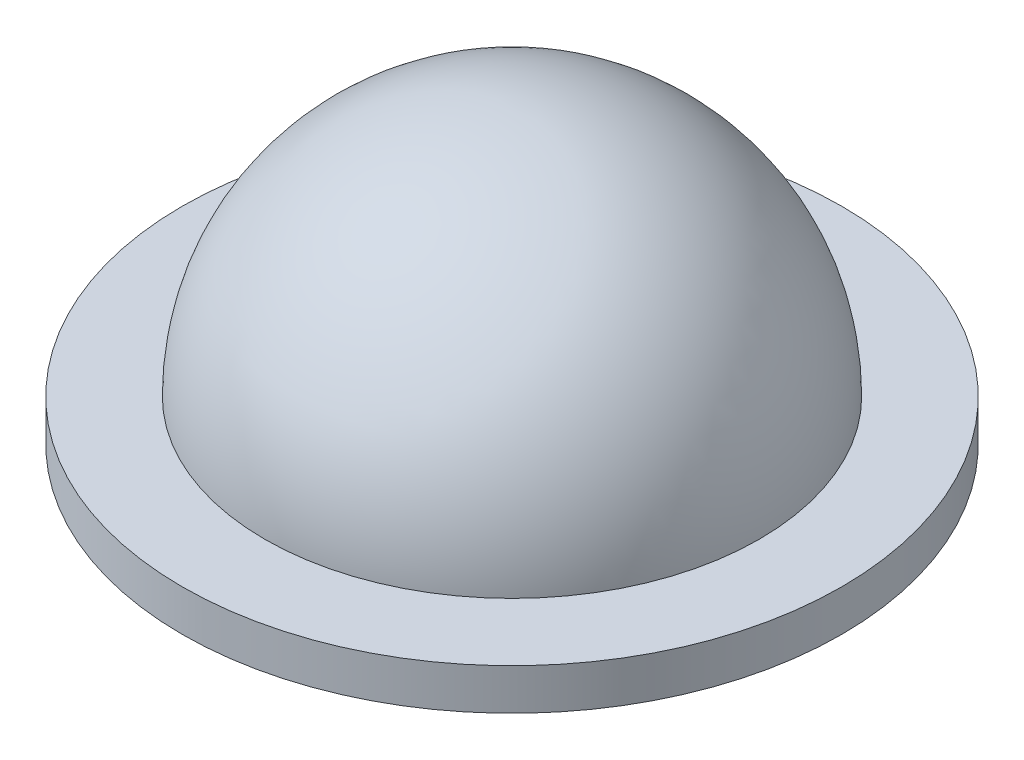
ISO-10303-21;
HEADER;
FILE_DESCRIPTION(('STEP AP214'),'2;1');
FILE_NAME('part.step','',(''),(''),'','','');
FILE_SCHEMA(('AUTOMOTIVE_DESIGN { 1 0 10303 214 1 1 1 1 }'));
ENDSEC;
DATA;
#1=APPLICATION_CONTEXT('core data for automotive mechanical design processes');
#2=APPLICATION_PROTOCOL_DEFINITION('international standard','automotive_design',2000,#1);
#3=PRODUCT_CONTEXT('',#1,'mechanical');
#4=PRODUCT('Part','Part','',(#3));
#5=PRODUCT_RELATED_PRODUCT_CATEGORY('part','',(#4));
#6=PRODUCT_DEFINITION_FORMATION('','',#4);
#7=PRODUCT_DEFINITION_CONTEXT('part definition',#1,'design');
#8=PRODUCT_DEFINITION('design','',#6,#7);
#9=PRODUCT_DEFINITION_SHAPE('','',#8);
#10=(LENGTH_UNIT() NAMED_UNIT(*) SI_UNIT(.MILLI.,.METRE.));
#11=(NAMED_UNIT(*) PLANE_ANGLE_UNIT() SI_UNIT($,.RADIAN.));
#12=(NAMED_UNIT(*) SI_UNIT($,.STERADIAN.) SOLID_ANGLE_UNIT());
#13=UNCERTAINTY_MEASURE_WITH_UNIT(LENGTH_MEASURE(1.E-05),#10,'distance_accuracy_value','');
#14=(GEOMETRIC_REPRESENTATION_CONTEXT(3) GLOBAL_UNCERTAINTY_ASSIGNED_CONTEXT((#13)) GLOBAL_UNIT_ASSIGNED_CONTEXT((#10,
#11,#12)) REPRESENTATION_CONTEXT('',''));
#15=CARTESIAN_POINT('',(0.,0.,0.));
#16=DIRECTION('',(0.,0.,1.));
#17=DIRECTION('',(1.,0.,0.));
#18=AXIS2_PLACEMENT_3D('',#15,#16,#17);
#19=CARTESIAN_POINT('',(4.89897948556636,1.,0.));
#20=DIRECTION('',(0.,1.,0.));
#21=DIRECTION('',(-1.,0.,0.));
#22=AXIS2_PLACEMENT_3D('',#19,#20,#21);
#23=SPHERICAL_SURFACE('',#22,5.);
#24=CARTESIAN_POINT('',(4.89897948556636,0.,0.));
#25=DIRECTION('',(0.,1.,0.));
#26=DIRECTION('',(0.,0.,1.));
#27=AXIS2_PLACEMENT_3D('',#24,#25,#26);
#28=CIRCLE('',#27,4.89897948556636);
#29=CARTESIAN_POINT('',(4.89897948556636,0.,4.89897948556636));
#30=VERTEX_POINT('',#29);
#31=EDGE_CURVE('E54',#30,#30,#28,.T.);
#32=ORIENTED_EDGE('',*,*,#31,.F.);
#33=EDGE_LOOP('',(#32));
#34=FACE_BOUND('',#33,.T.);
#35=ADVANCED_FACE('F37',(#34),#23,.F.);
#36=CARTESIAN_POINT('',(4.89897948556636,0.999999999999999,0.));
#37=DIRECTION('',(0.,1.,0.));
#38=DIRECTION('',(1.,0.,0.));
#39=AXIS2_PLACEMENT_3D('',#36,#37,#38);
#40=SPHERICAL_SURFACE('',#39,6.);
#41=CARTESIAN_POINT('',(4.89897948556636,0.999999999999999,0.));
#42=DIRECTION('',(0.,1.,0.));
#43=DIRECTION('',(0.,0.,1.));
#44=AXIS2_PLACEMENT_3D('',#41,#42,#43);
#45=CIRCLE('',#44,6.);
#46=CARTESIAN_POINT('',(4.89897948556636,0.999999999999999,6.));
#47=VERTEX_POINT('',#46);
#48=EDGE_CURVE('E10',#47,#47,#45,.T.);
#49=ORIENTED_EDGE('',*,*,#48,.T.);
#50=EDGE_LOOP('',(#49));
#51=FACE_BOUND('',#50,.T.);
#52=ADVANCED_FACE('F65',(#51),#40,.T.);
#53=CARTESIAN_POINT('',(-3.10102051443364,0.999999999999999,0.));
#54=DIRECTION('',(0.,1.,0.));
#55=DIRECTION('',(0.,0.,1.));
#56=AXIS2_PLACEMENT_3D('',#53,#54,#55);
#57=PLANE('',#56);
#58=CARTESIAN_POINT('',(4.89897948556636,0.999999999999999,0.));
#59=DIRECTION('',(0.,1.,0.));
#60=DIRECTION('',(0.,0.,1.));
#61=AXIS2_PLACEMENT_3D('',#58,#59,#60);
#62=CIRCLE('',#61,8.);
#63=CARTESIAN_POINT('',(4.89897948556636,0.999999999999999,8.));
#64=VERTEX_POINT('',#63);
#65=EDGE_CURVE('E44',#64,#64,#62,.T.);
#66=ORIENTED_EDGE('',*,*,#65,.T.);
#67=EDGE_LOOP('',(#66));
#68=FACE_BOUND('',#67,.T.);
#69=ORIENTED_EDGE('',*,*,#48,.F.);
#70=EDGE_LOOP('',(#69));
#71=FACE_BOUND('',#70,.T.);
#72=ADVANCED_FACE('F69',(#68,#71),#57,.T.);
#73=CARTESIAN_POINT('',(4.89897948556636,7.,0.));
#74=DIRECTION('',(0.,1.,0.));
#75=DIRECTION('',(0.,0.,1.));
#76=AXIS2_PLACEMENT_3D('',#73,#74,#75);
#77=CYLINDRICAL_SURFACE('',#76,8.);
#78=CARTESIAN_POINT('',(4.89897948556636,0.,0.));
#79=DIRECTION('',(0.,1.,0.));
#80=DIRECTION('',(0.,0.,1.));
#81=AXIS2_PLACEMENT_3D('',#78,#79,#80);
#82=CIRCLE('',#81,8.);
#83=CARTESIAN_POINT('',(4.89897948556636,0.,8.));
#84=VERTEX_POINT('',#83);
#85=EDGE_CURVE('E49',#84,#84,#82,.T.);
#86=ORIENTED_EDGE('',*,*,#85,.T.);
#87=EDGE_LOOP('',(#86));
#88=FACE_BOUND('',#87,.T.);
#89=ORIENTED_EDGE('',*,*,#65,.F.);
#90=EDGE_LOOP('',(#89));
#91=FACE_BOUND('',#90,.T.);
#92=ADVANCED_FACE('F73',(#88,#91),#77,.T.);
#93=CARTESIAN_POINT('',(0.,0.,0.));
#94=DIRECTION('',(0.,-1.,0.));
#95=DIRECTION('',(0.,0.,-1.));
#96=AXIS2_PLACEMENT_3D('',#93,#94,#95);
#97=PLANE('',#96);
#98=ORIENTED_EDGE('',*,*,#31,.T.);
#99=EDGE_LOOP('',(#98));
#100=FACE_BOUND('',#99,.T.);
#101=ORIENTED_EDGE('',*,*,#85,.F.);
#102=EDGE_LOOP('',(#101));
#103=FACE_BOUND('',#102,.T.);
#104=ADVANCED_FACE('F61',(#100,#103),#97,.T.);
#105=CLOSED_SHELL('',(#35,#52,#72,#92,#104));
#106=MANIFOLD_SOLID_BREP('B2',#105);
#107=ADVANCED_BREP_SHAPE_REPRESENTATION('',(#18,#106),#14);
#108=SHAPE_DEFINITION_REPRESENTATION(#9,#107);
ENDSEC;
END-ISO-10303-21;
